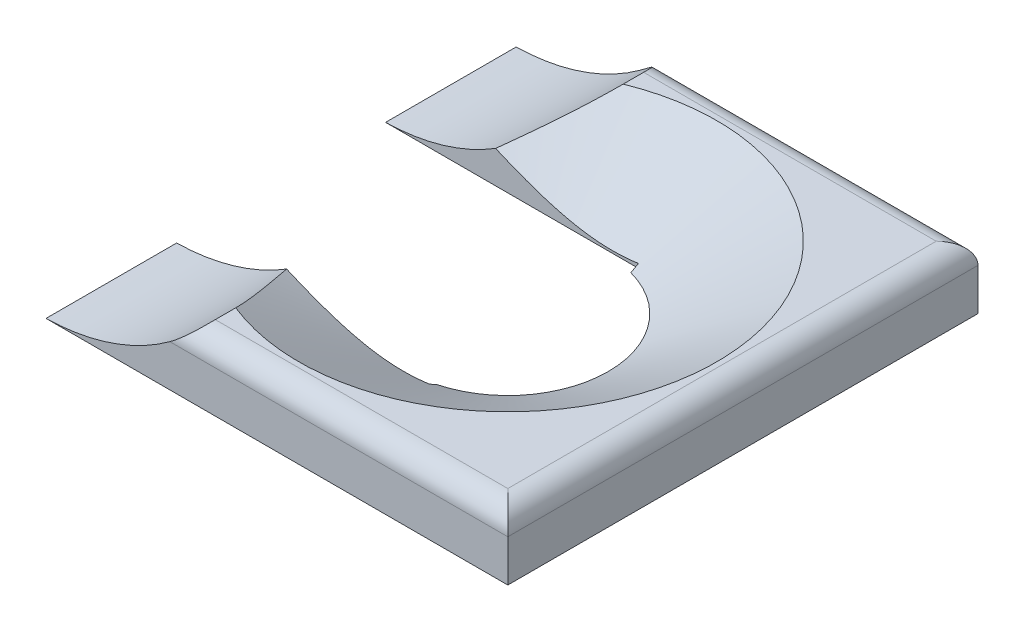
ISO-10303-21;
HEADER;
FILE_DESCRIPTION(('STEP AP214'),'2;1');
FILE_NAME('part.step','',(''),(''),'','','');
FILE_SCHEMA(('AUTOMOTIVE_DESIGN { 1 0 10303 214 1 1 1 1 }'));
ENDSEC;
DATA;
#1=APPLICATION_CONTEXT('core data for automotive mechanical design processes');
#2=APPLICATION_PROTOCOL_DEFINITION('international standard','automotive_design',2000,#1);
#3=PRODUCT_CONTEXT('',#1,'mechanical');
#4=PRODUCT('Part','Part','',(#3));
#5=PRODUCT_RELATED_PRODUCT_CATEGORY('part','',(#4));
#6=PRODUCT_DEFINITION_FORMATION('','',#4);
#7=PRODUCT_DEFINITION_CONTEXT('part definition',#1,'design');
#8=PRODUCT_DEFINITION('design','',#6,#7);
#9=PRODUCT_DEFINITION_SHAPE('','',#8);
#10=(LENGTH_UNIT() NAMED_UNIT(*) SI_UNIT(.MILLI.,.METRE.));
#11=(NAMED_UNIT(*) PLANE_ANGLE_UNIT() SI_UNIT($,.RADIAN.));
#12=(NAMED_UNIT(*) SI_UNIT($,.STERADIAN.) SOLID_ANGLE_UNIT());
#13=UNCERTAINTY_MEASURE_WITH_UNIT(LENGTH_MEASURE(1.E-05),#10,'distance_accuracy_value','');
#14=(GEOMETRIC_REPRESENTATION_CONTEXT(3) GLOBAL_UNCERTAINTY_ASSIGNED_CONTEXT((#13)) GLOBAL_UNIT_ASSIGNED_CONTEXT((#10,
#11,#12)) REPRESENTATION_CONTEXT('',''));
#15=CARTESIAN_POINT('',(0.,0.,0.));
#16=DIRECTION('',(0.,0.,1.));
#17=DIRECTION('',(1.,0.,0.));
#18=AXIS2_PLACEMENT_3D('',#15,#16,#17);
#19=CARTESIAN_POINT('',(0.,-6.,0.));
#20=DIRECTION('',(0.,1.,0.));
#21=DIRECTION('',(0.,0.,1.));
#22=AXIS2_PLACEMENT_3D('',#19,#20,#21);
#23=PLANE('',#22);
#24=DIRECTION('',(-1.,0.,0.));
#25=VECTOR('',#24,1.);
#26=CARTESIAN_POINT('',(25.,-5.99999999999999,-12.5));
#27=LINE('',#26,#25);
#28=CARTESIAN_POINT('',(25.,-5.99999999999999,-12.5));
#29=VERTEX_POINT('',#28);
#30=CARTESIAN_POINT('',(0.799608092284132,-6.,-12.5000000000001));
#31=VERTEX_POINT('',#30);
#32=EDGE_CURVE('E69',#29,#31,#27,.T.);
#33=ORIENTED_EDGE('',*,*,#32,.F.);
#34=DIRECTION('',(0.,0.,-1.));
#35=VECTOR('',#34,1.);
#36=CARTESIAN_POINT('',(25.,-5.99999999999999,-32.5));
#37=LINE('',#36,#35);
#38=CARTESIAN_POINT('',(25.,-5.99999999999999,-13.2232653275267));
#39=VERTEX_POINT('',#38);
#40=EDGE_CURVE('E144',#29,#39,#37,.T.);
#41=ORIENTED_EDGE('',*,*,#40,.T.);
#42=CARTESIAN_POINT('',(22.5,-6.,-22.5));
#43=DIRECTION('',(0.,1.,0.));
#44=DIRECTION('',(0.,0.,1.));
#45=AXIS2_PLACEMENT_3D('',#42,#43,#44);
#46=CIRCLE('',#45,9.60769515458667);
#47=CARTESIAN_POINT('',(25.,-5.99999999999999,-31.7767346724733));
#48=VERTEX_POINT('',#47);
#49=EDGE_CURVE('E234',#39,#48,#46,.T.);
#50=ORIENTED_EDGE('',*,*,#49,.T.);
#51=CARTESIAN_POINT('',(25.,-5.99999999999999,-32.5));
#52=VERTEX_POINT('',#51);
#53=EDGE_CURVE('E141',#48,#52,#37,.T.);
#54=ORIENTED_EDGE('',*,*,#53,.T.);
#55=DIRECTION('',(-1.,0.,0.));
#56=VECTOR('',#55,1.);
#57=CARTESIAN_POINT('',(25.,-5.99999999999999,-32.5));
#58=LINE('',#57,#56);
#59=CARTESIAN_POINT('',(0.799608092285013,-5.99999999999998,-32.5));
#60=VERTEX_POINT('',#59);
#61=EDGE_CURVE('E154',#52,#60,#58,.T.);
#62=ORIENTED_EDGE('',*,*,#61,.T.);
#63=DIRECTION('',(0.,0.,1.));
#64=VECTOR('',#63,1.);
#65=CARTESIAN_POINT('',(0.799608092284132,-6.,-1000.));
#66=LINE('',#65,#64);
#67=CARTESIAN_POINT('',(0.799608092284267,-5.99999999999999,-45.));
#68=VERTEX_POINT('',#67);
#69=EDGE_CURVE('E219',#60,#68,#66,.F.);
#70=ORIENTED_EDGE('',*,*,#69,.T.);
#71=DIRECTION('',(1.,0.,0.));
#72=VECTOR('',#71,1.);
#73=CARTESIAN_POINT('',(0.,-6.,-45.));
#74=LINE('',#73,#72);
#75=CARTESIAN_POINT('',(45.,-6.,-45.));
#76=VERTEX_POINT('',#75);
#77=EDGE_CURVE('E244',#68,#76,#74,.T.);
#78=ORIENTED_EDGE('',*,*,#77,.T.);
#79=DIRECTION('',(0.,0.,-1.));
#80=VECTOR('',#79,1.);
#81=CARTESIAN_POINT('',(45.,-6.,0.));
#82=LINE('',#81,#80);
#83=CARTESIAN_POINT('',(45.,-6.,0.));
#84=VERTEX_POINT('',#83);
#85=EDGE_CURVE('E238',#84,#76,#82,.T.);
#86=ORIENTED_EDGE('',*,*,#85,.F.);
#87=DIRECTION('',(1.,0.,0.));
#88=VECTOR('',#87,1.);
#89=CARTESIAN_POINT('',(0.,-6.,0.));
#90=LINE('',#89,#88);
#91=CARTESIAN_POINT('',(0.799608092284132,-6.,0.));
#92=VERTEX_POINT('',#91);
#93=EDGE_CURVE('E224',#92,#84,#90,.T.);
#94=ORIENTED_EDGE('',*,*,#93,.F.);
#95=EDGE_CURVE('E153',#92,#31,#66,.F.);
#96=ORIENTED_EDGE('',*,*,#95,.T.);
#97=EDGE_LOOP('',(#33,#41,#50,#54,#62,#70,#78,#86,#94,#96));
#98=FACE_BOUND('',#97,.T.);
#99=ADVANCED_FACE('F39',(#98),#23,.F.);
#100=CARTESIAN_POINT('',(22.5,0.,-22.5));
#101=DIRECTION('',(0.,1.,0.));
#102=DIRECTION('',(0.,0.,1.));
#103=AXIS2_PLACEMENT_3D('',#100,#101,#102);
#104=CONICAL_SURFACE('',#103,20.,1.0471975511966);
#105=CARTESIAN_POINT('',(43.4940559552794,1.87872098331582,-32.5));
#106=CARTESIAN_POINT('',(43.007728747701,1.62525957954242,-32.5));
#107=CARTESIAN_POINT('',(42.5207547233175,1.37302931281447,-32.5));
#108=CARTESIAN_POINT('',(41.5452087685271,0.871662224671157,-32.5));
#109=CARTESIAN_POINT('',(41.0566368151322,0.622525448008571,-32.5));
#110=CARTESIAN_POINT('',(40.0768771370397,0.127616322611146,-32.5));
#111=CARTESIAN_POINT('',(39.5856866036701,-0.118150474682648,-32.5));
#112=CARTESIAN_POINT('',(38.6010117134967,-0.605068731949847,-32.5));
#113=CARTESIAN_POINT('',(38.1075273262558,-0.84622013046344,-32.5));
#114=CARTESIAN_POINT('',(37.089596405798,-1.33634217174281,-32.5));
#115=CARTESIAN_POINT('',(36.564987243118,-1.58497588022162,-32.5));
#116=CARTESIAN_POINT('',(35.511958162939,-2.07400660911354,-32.5));
#117=CARTESIAN_POINT('',(34.983538416479,-2.31440399646478,-32.5));
#118=CARTESIAN_POINT('',(33.9222735551425,-2.78434956213583,-32.5));
#119=CARTESIAN_POINT('',(33.3894314054591,-3.01390441262653,-32.5));
#120=CARTESIAN_POINT('',(32.3177246917949,-3.45897208245175,-32.5));
#121=CARTESIAN_POINT('',(31.7788588845568,-3.67448193784091,-32.5));
#122=CARTESIAN_POINT('',(30.9326588806914,-3.99589819046851,-32.5));
#123=CARTESIAN_POINT('',(30.6277927581274,-4.10830160808771,-32.5));
#124=CARTESIAN_POINT('',(30.0155396750321,-4.3260837708094,-32.5));
#125=CARTESIAN_POINT('',(29.7081526372934,-4.43146229985293,-32.5));
#126=CARTESIAN_POINT('',(29.0907689920233,-4.6338845015016,-32.5));
#127=CARTESIAN_POINT('',(28.7807734659102,-4.73093145767983,-32.5));
#128=CARTESIAN_POINT('',(28.1578958168055,-4.91525638522499,-32.5));
#129=CARTESIAN_POINT('',(27.8450138805865,-5.00253498394545,-32.5));
#130=CARTESIAN_POINT('',(27.2229154463171,-5.16394489487067,-32.5));
#131=CARTESIAN_POINT('',(26.9137613618124,-5.23831520919239,-32.5));
#132=CARTESIAN_POINT('',(26.2926706817501,-5.37443591464721,-32.5));
#133=CARTESIAN_POINT('',(25.9807341383797,-5.43618654195559,-32.5));
#134=CARTESIAN_POINT('',(25.3544652187669,-5.54536850375159,-32.5));
#135=CARTESIAN_POINT('',(25.0401338122565,-5.59280534796775,-32.5));
#136=CARTESIAN_POINT('',(24.4094718723196,-5.67187758935576,-32.5));
#137=CARTESIAN_POINT('',(24.0931413573813,-5.70351313244601,-32.5));
#138=CARTESIAN_POINT('',(23.4544353884373,-5.75019228460836,-32.5));
#139=CARTESIAN_POINT('',(23.1320408255464,-5.76497792654521,-32.5));
#140=CARTESIAN_POINT('',(22.4869289319596,-5.77649886849303,-32.5));
#141=CARTESIAN_POINT('',(22.1642116044765,-5.77323434642111,-32.5));
#142=CARTESIAN_POINT('',(21.5194799756329,-5.7487891552913,-32.5));
#143=CARTESIAN_POINT('',(21.1974656412962,-5.72760934553205,-32.5));
#144=CARTESIAN_POINT('',(20.5550273436552,-5.66816363724642,-32.5));
#145=CARTESIAN_POINT('',(20.2346034303806,-5.62989720462828,-32.5));
#146=CARTESIAN_POINT('',(19.5875494795366,-5.53641427931121,-32.5));
#147=CARTESIAN_POINT('',(19.2609812915011,-5.48077369754318,-32.5));
#148=CARTESIAN_POINT('',(18.6107264607246,-5.35473593320268,-32.5));
#149=CARTESIAN_POINT('',(18.287039897491,-5.28433834477396,-32.5));
#150=CARTESIAN_POINT('',(17.6425716077276,-5.13066158627009,-32.5));
#151=CARTESIAN_POINT('',(17.3217915558282,-5.04737543491772,-32.5));
#152=CARTESIAN_POINT('',(16.8429584254359,-4.91419384364244,-32.5));
#153=CARTESIAN_POINT('',(16.683740542524,-4.8684257441897,-32.5));
#154=CARTESIAN_POINT('',(16.3660574441865,-4.77434805229323,-32.5));
#155=CARTESIAN_POINT('',(16.2075922261794,-4.7260384685728,-32.5));
#156=CARTESIAN_POINT('',(15.7280316619813,-4.57595737924169,-32.5));
#157=CARTESIAN_POINT('',(15.4080792973,-4.47052254573861,-32.5));
#158=CARTESIAN_POINT('',(14.7709606187218,-4.25151482670617,-32.5));
#159=CARTESIAN_POINT('',(14.4537945509965,-4.13794123006899,-32.5));
#160=CARTESIAN_POINT('',(13.8218978961244,-3.90391063334909,-32.5));
#161=CARTESIAN_POINT('',(13.5071681663124,-3.78345132502504,-32.5));
#162=CARTESIAN_POINT('',(12.8799938904579,-3.53676539145372,-32.5));
#163=CARTESIAN_POINT('',(12.5675492846814,-3.41053891759158,-32.5));
#164=CARTESIAN_POINT('',(11.9442675228702,-3.15303880043591,-32.5));
#165=CARTESIAN_POINT('',(11.6334330385138,-3.02175870427437,-32.5));
#166=CARTESIAN_POINT('',(11.0135502887583,-2.75504141057314,-32.5));
#167=CARTESIAN_POINT('',(10.7045020562975,-2.61960413666432,-32.5));
#168=CARTESIAN_POINT('',(9.77982575719238,-2.20805199858767,-32.5));
#169=CARTESIAN_POINT('',(9.16655078197433,-1.92664862695632,-32.5));
#170=CARTESIAN_POINT('',(7.94206397192468,-1.35213759274943,-32.5));
#171=CARTESIAN_POINT('',(7.33087492911006,-1.05898166261703,-32.5));
#172=CARTESIAN_POINT('',(6.11234248472904,-0.464752277876298,-32.5));
#173=CARTESIAN_POINT('',(5.50499920398272,-0.163678576036185,-32.5));
#174=CARTESIAN_POINT('',(4.29382897364554,0.444315736778011,-32.5));
#175=CARTESIAN_POINT('',(3.68999971043564,0.751231749612328,-32.5));
#176=CARTESIAN_POINT('',(2.4847901432784,1.36981213210454,-32.5));
#177=CARTESIAN_POINT('',(1.88340981201425,1.68147644861223,-32.5));
#178=CARTESIAN_POINT('',(0.765518445295967,2.26529684285077,-32.5));
#179=CARTESIAN_POINT('',(0.248753206499583,2.53696681377059,-32.5));
#180=CARTESIAN_POINT('',(-0.783540351624226,3.08264775779926,-32.5));
#181=CARTESIAN_POINT('',(-1.29906866851242,3.35665873551975,-32.5));
#182=CARTESIAN_POINT('',(-2.84430998262122,4.18173494027465,-32.5));
#183=CARTESIAN_POINT('',(-3.87245945932132,4.7357281650839,-32.5));
#184=CARTESIAN_POINT('',(-5.91648115136875,5.84432623183798,-32.5));
#185=CARTESIAN_POINT('',(-6.93238066594894,6.39888083868717,-32.5));
#186=CARTESIAN_POINT('',(-8.4544040630653,7.23374911061521,-32.5));
#187=CARTESIAN_POINT('',(-8.96138007503282,7.51251091686916,-32.5));
#188=CARTESIAN_POINT('',(-9.97483005153627,8.07094361231531,-32.5));
#189=CARTESIAN_POINT('',(-10.4813040169609,8.35061449989459,-32.5));
#190=CARTESIAN_POINT('',(-10.9875606954573,8.63067800926934,-32.5));
#191=B_SPLINE_CURVE_WITH_KNOTS('',3,(#105,#106,#107,#108,#109,#110,#111,#112,#113,#114,#115,
#116,#117,#118,#119,#120,#121,#122,#123,#124,#125,#126,#127,#128,#129,#130,#131,#132,#133,#134,
#135,#136,#137,#138,#139,#140,#141,#142,#143,#144,#145,#146,#147,#148,#149,#150,#151,#152,#153,
#154,#155,#156,#157,#158,#159,#160,#161,#162,#163,#164,#165,#166,#167,#168,#169,#170,#171,#172,
#173,#174,#175,#176,#177,#178,#179,#180,#181,#182,#183,#184,#185,#186,#187,#188,#189,#190),
.UNSPECIFIED.,.F.,.F.,(4,2,2,2,2,2,2,2,2,2,2,2,2,2,2,2,2,2,2,2,2,2,2,2,2,2,2,2,2,2,2,2,2,2,2,2,
2,2,2,2,2,2,4),(0.,1.6452441376992,3.29051204908708,4.9382255333208,6.58596094367785,
8.32754438780895,10.0690501411154,11.8094698767187,13.5502557153952,14.5249698217452,
15.4997138927922,16.4740720248454,17.4483675447147,18.4020589102933,19.3557324260679,
20.3090383796912,21.2623355297698,22.2300391855501,23.1977333028721,24.1653810078172,
25.1330589615046,26.1264961777168,27.1199607196335,28.1139652818762,28.6109444875942,
29.1079219876073,30.118408162236,31.1289827339338,32.1398980819833,33.1507869092533,
34.1630123704771,35.1752564378591,37.1993697561408,39.2328790004987,41.2664518165886,
43.2984853795216,45.3304962135453,47.0819625362271,48.8334323099922,52.3371166393677,
55.8093151537973,57.5449973463896,59.2806764611538),.UNSPECIFIED.);
#192=CARTESIAN_POINT('',(25.,-5.59581502667344,-32.5));
#193=VERTEX_POINT('',#192);
#194=CARTESIAN_POINT('',(11.3311951751726,-2.8917141078333,-32.5));
#195=VERTEX_POINT('',#194);
#196=EDGE_CURVE('E61',#193,#195,#191,.T.);
#197=ORIENTED_EDGE('',*,*,#196,.F.);
#198=CARTESIAN_POINT('',(25.,-5.59542294744274,-32.5007));
#199=CARTESIAN_POINT('',(25.,-5.71798390812599,-32.2818761307911));
#200=CARTESIAN_POINT('',(25.,-5.84037278324019,-32.0629556192703));
#201=CARTESIAN_POINT('',(25.,-6.08471149163078,-31.624868143803));
#202=CARTESIAN_POINT('',(25.,-6.20666132242188,-31.4057011784706));
#203=CARTESIAN_POINT('',(25.,-6.45005719331809,-30.9670133085192));
#204=CARTESIAN_POINT('',(25.,-6.57150309479022,-30.7474923269443));
#205=CARTESIAN_POINT('',(25.,-6.81372406570912,-30.3080810788126));
#206=CARTESIAN_POINT('',(25.,-6.93449913680215,-30.0881908131638));
#207=CARTESIAN_POINT('',(25.,-7.17490188956893,-29.6484857665701));
#208=CARTESIAN_POINT('',(25.,-7.29453166249714,-29.4286721298185));
#209=CARTESIAN_POINT('',(25.,-7.53269407588617,-28.9884514127713));
#210=CARTESIAN_POINT('',(25.,-7.65122671932992,-28.7680443340912));
#211=CARTESIAN_POINT('',(25.,-7.88682444978953,-28.3264823767199));
#212=CARTESIAN_POINT('',(25.,-8.00388972242478,-28.1053275971985));
#213=CARTESIAN_POINT('',(25.,-8.23604609260065,-27.6619854550818));
#214=CARTESIAN_POINT('',(25.,-8.35113721851594,-27.4397981073863));
#215=CARTESIAN_POINT('',(25.,-8.57769124641609,-26.9956891055971));
#216=CARTESIAN_POINT('',(25.,-8.68917497297535,-26.773778097628));
#217=CARTESIAN_POINT('',(25.,-8.90822369633672,-26.3279645369578));
#218=CARTESIAN_POINT('',(25.,-9.01578800030748,-26.1040616407727));
#219=CARTESIAN_POINT('',(25.,-9.1729029944812,-25.765511970469));
#220=CARTESIAN_POINT('',(25.,-9.22470054669997,-25.6519092808027));
#221=CARTESIAN_POINT('',(25.,-9.3263730448434,-25.4238486600082));
#222=CARTESIAN_POINT('',(25.,-9.37624805852581,-25.3093907591911));
#223=CARTESIAN_POINT('',(25.,-9.47356140009374,-25.0794620178723));
#224=CARTESIAN_POINT('',(25.,-9.52100015392408,-24.9639913585984));
#225=CARTESIAN_POINT('',(25.,-9.61276277136262,-24.731824749168));
#226=CARTESIAN_POINT('',(25.,-9.65708687770312,-24.6151288953106));
#227=CARTESIAN_POINT('',(25.,-9.75205206385703,-24.3516520643247));
#228=CARTESIAN_POINT('',(25.,-9.80159982611433,-24.2044705200988));
#229=CARTESIAN_POINT('',(25.,-9.89220692905542,-23.9074681007986));
#230=CARTESIAN_POINT('',(25.,-9.93326594090322,-23.7576471237223));
#231=CARTESIAN_POINT('',(25.,-10.0034996619226,-23.4569850763879));
#232=CARTESIAN_POINT('',(25.,-10.0328077563961,-23.3061764334474));
#233=CARTESIAN_POINT('',(25.,-10.066106700383,-23.0784403812983));
#234=CARTESIAN_POINT('',(25.,-10.0754288745086,-23.0022798004238));
#235=CARTESIAN_POINT('',(25.,-10.0902329286604,-22.8495904799849));
#236=CARTESIAN_POINT('',(25.,-10.0957153810251,-22.7730617970018));
#237=CARTESIAN_POINT('',(25.,-10.1026913417669,-22.6188174596598));
#238=CARTESIAN_POINT('',(25.,-10.1041317019276,-22.5410993796122));
#239=CARTESIAN_POINT('',(25.,-10.1028183651766,-22.3856990850083));
#240=CARTESIAN_POINT('',(25.,-10.1000646587005,-22.3080168705343));
#241=CARTESIAN_POINT('',(25.,-10.0904646922944,-22.1528977825104));
#242=CARTESIAN_POINT('',(25.,-10.0836179248267,-22.0754609405839));
#243=CARTESIAN_POINT('',(25.,-10.0660734555734,-21.9210202685318));
#244=CARTESIAN_POINT('',(25.,-10.0553750793206,-21.8440165166461));
#245=CARTESIAN_POINT('',(25.,-10.0177123301459,-21.6120979345454));
#246=CARTESIAN_POINT('',(25.,-9.98530271797792,-21.4580485176302));
#247=CARTESIAN_POINT('',(25.,-9.92833229006436,-21.2291463869074));
#248=CARTESIAN_POINT('',(25.,-9.90794420938477,-21.1531916179345));
#249=CARTESIAN_POINT('',(25.,-9.86476560805213,-21.0019674363668));
#250=CARTESIAN_POINT('',(25.,-9.84197521773316,-20.9266979868314));
#251=CARTESIAN_POINT('',(25.,-9.7736918965284,-20.711813893376));
#252=CARTESIAN_POINT('',(25.,-9.72565208985985,-20.5730106257955));
#253=CARTESIAN_POINT('',(25.,-9.62429358442304,-20.297331971462));
#254=CARTESIAN_POINT('',(25.,-9.5709734186144,-20.1604571326168));
#255=CARTESIAN_POINT('',(25.,-9.46036000184065,-19.8881752099077));
#256=CARTESIAN_POINT('',(25.,-9.40306289083896,-19.7527697038093));
#257=CARTESIAN_POINT('',(25.,-9.28552405973546,-19.4832666404652));
#258=CARTESIAN_POINT('',(25.,-9.22528263716398,-19.3491689526972));
#259=CARTESIAN_POINT('',(25.,-9.10238080747231,-19.0816453708354));
#260=CARTESIAN_POINT('',(25.,-9.03971422628722,-18.9482223230742));
#261=CARTESIAN_POINT('',(25.,-8.91262201810944,-18.6822152267993));
#262=CARTESIAN_POINT('',(25.,-8.84819634855885,-18.54963119868));
#263=CARTESIAN_POINT('',(25.,-8.65293911618022,-18.1530403797228));
#264=CARTESIAN_POINT('',(25.,-8.52005703322708,-17.8900442870057));
#265=CARTESIAN_POINT('',(25.,-8.25045270572592,-17.3652137865926));
#266=CARTESIAN_POINT('',(25.,-8.1137217336611,-17.1033838938536));
#267=CARTESIAN_POINT('',(25.,-7.83783448953081,-16.5809645228569));
#268=CARTESIAN_POINT('',(25.,-7.69867791217248,-16.3203752060734));
#269=CARTESIAN_POINT('',(25.,-7.41887059384313,-15.8005001834014));
#270=CARTESIAN_POINT('',(25.,-7.27822237461007,-15.5412131174116));
#271=CARTESIAN_POINT('',(25.,-6.99568273548935,-15.0233169758727));
#272=CARTESIAN_POINT('',(25.,-6.85379131248053,-14.7647079020278));
#273=CARTESIAN_POINT('',(25.,-6.61891985026178,-14.3384696715833));
#274=CARTESIAN_POINT('',(25.,-6.52621040947891,-14.1706912369273));
#275=CARTESIAN_POINT('',(25.,-6.34043147756909,-13.8352738490543));
#276=CARTESIAN_POINT('',(25.,-6.2473618948925,-13.6676349465436));
#277=CARTESIAN_POINT('',(25.,-6.06127212645419,-13.3331135499874));
#278=CARTESIAN_POINT('',(25.,-5.96825295199788,-13.1662304931722));
#279=CARTESIAN_POINT('',(25.,-5.78199745106825,-12.8326459181289));
#280=CARTESIAN_POINT('',(25.,-5.68876119150511,-12.6659443625452));
#281=CARTESIAN_POINT('',(25.,-5.59542294744274,-12.4993));
#282=B_SPLINE_CURVE_WITH_KNOTS('',3,(#198,#199,#200,#201,#202,#203,#204,#205,#206,#207,#208,
#209,#210,#211,#212,#213,#214,#215,#216,#217,#218,#219,#220,#221,#222,#223,#224,#225,#226,#227,
#228,#229,#230,#231,#232,#233,#234,#235,#236,#237,#238,#239,#240,#241,#242,#243,#244,#245,#246,
#247,#248,#249,#250,#251,#252,#253,#254,#255,#256,#257,#258,#259,#260,#261,#262,#263,#264,#265,
#266,#267,#268,#269,#270,#271,#272,#273,#274,#275,#276,#277,#278,#279,#280,#281),.UNSPECIFIED.,
.F.,.F.,(4,2,2,2,2,2,2,2,2,2,2,2,2,2,2,2,2,2,2,2,2,2,2,2,2,2,2,2,2,2,2,2,2,2,2,2,2,2,2,2,2,4),
(0.,0.75242678423455,1.50485782103585,2.25748369856578,3.01010772828899,3.76088090291765,
4.51165203570408,5.26232721907431,6.0129916038338,6.75799166213904,7.50312278051934,
7.87767171769856,8.25220744222272,8.6266774600948,9.00111826213907,9.46681932693975,
9.93253842862219,10.3928103422615,10.6229146853387,10.8529847223789,11.0860660160963,
11.319147841353,11.5522585746508,11.7854101485708,12.2570224499882,12.4929298184241,
12.7288243946047,13.1693088555633,13.6099160413463,14.0509570293145,14.4919535407229,
14.934158027003,15.3763732211019,16.2603052170913,17.1464352553107,18.0326776411804,
18.9176058003304,19.8025361818019,20.377602606714,20.9528263322793,21.5259951164235,
22.0990059400322),.UNSPECIFIED.);
#283=EDGE_CURVE('E11',#193,#48,#282,.T.);
#284=ORIENTED_EDGE('',*,*,#283,.T.);
#285=ORIENTED_EDGE('',*,*,#49,.F.);
#286=CARTESIAN_POINT('',(25.,-5.59581502667344,-12.5));
#287=VERTEX_POINT('',#286);
#288=EDGE_CURVE('E44',#39,#287,#282,.T.);
#289=ORIENTED_EDGE('',*,*,#288,.T.);
#290=CARTESIAN_POINT('',(-10.9875606954573,8.63067800926933,-12.5));
#291=CARTESIAN_POINT('',(-10.2492738137513,8.22227397900555,-12.5));
#292=CARTESIAN_POINT('',(-9.51053718979665,7.81467997109563,-12.5));
#293=CARTESIAN_POINT('',(-8.03192208846583,7.00155067685479,-12.5));
#294=CARTESIAN_POINT('',(-7.29204359934074,6.59601541189349,-12.5));
#295=CARTESIAN_POINT('',(-5.81059202647232,5.78727297921735,-12.5));
#296=CARTESIAN_POINT('',(-5.06901834061507,5.38406691368944,-12.5));
#297=CARTESIAN_POINT('',(-3.58417934754002,4.58078710143311,-12.5));
#298=CARTESIAN_POINT('',(-2.84091404769657,4.18071334108344,-12.5));
#299=CARTESIAN_POINT('',(-1.34306373339916,3.37960487705246,-12.5));
#300=CARTESIAN_POINT('',(-0.588452356161276,2.97861941591118,-12.5));
#301=CARTESIAN_POINT('',(0.923535517114934,2.18189627533595,-12.5));
#302=CARTESIAN_POINT('',(1.68091199936142,1.78615856977262,-12.5));
#303=CARTESIAN_POINT('',(3.1991038380684,1.00169773355637,-12.5));
#304=CARTESIAN_POINT('',(3.95991848224344,0.612973226421286,-12.5));
#305=CARTESIAN_POINT('',(5.48626455132046,-0.155098712782303,-12.5));
#306=CARTESIAN_POINT('',(6.25179585250347,-0.534446389510056,-12.5));
#307=CARTESIAN_POINT('',(7.40956247907183,-1.09589527669545,-12.5));
#308=CARTESIAN_POINT('',(7.79942908629263,-1.28288041567618,-12.5));
#309=CARTESIAN_POINT('',(8.58107899672395,-1.65279611526477,-12.5));
#310=CARTESIAN_POINT('',(8.97286227690192,-1.83572672445032,-12.5));
#311=CARTESIAN_POINT('',(9.75878019715877,-2.19674679255358,-12.5));
#312=CARTESIAN_POINT('',(10.1529154191161,-2.37483498727772,-12.5));
#313=CARTESIAN_POINT('',(10.9438296108025,-2.72505083016058,-12.5));
#314=CARTESIAN_POINT('',(11.3406085669806,-2.89717850884311,-12.5));
#315=CARTESIAN_POINT('',(12.1370473591925,-3.23401709896137,-12.5));
#316=CARTESIAN_POINT('',(12.5367054278548,-3.39873217413624,-12.5));
#317=CARTESIAN_POINT('',(13.3396623549921,-3.71911604655872,-12.5));
#318=CARTESIAN_POINT('',(13.7429613480274,-3.8747845078692,-12.5));
#319=CARTESIAN_POINT('',(14.5536628379415,-4.17481684863279,-12.5));
#320=CARTESIAN_POINT('',(14.9610642970274,-4.31918350983564,-12.5));
#321=CARTESIAN_POINT('',(15.7805452141751,-4.5938341175497,-12.5));
#322=CARTESIAN_POINT('',(16.1926241814018,-4.7241195268565,-12.5));
#323=CARTESIAN_POINT('',(17.160332652696,-5.0077627725613,-12.5));
#324=CARTESIAN_POINT('',(17.7180186735688,-5.15433180405747,-12.5));
#325=CARTESIAN_POINT('',(18.5613540587059,-5.34362055466987,-12.5));
#326=CARTESIAN_POINT('',(18.8435992973583,-5.4016225302207,-12.5));
#327=CARTESIAN_POINT('',(19.4101895170866,-5.50617518932327,-12.5));
#328=CARTESIAN_POINT('',(19.6945342196381,-5.55272736470912,-12.5));
#329=CARTESIAN_POINT('',(20.2628465422748,-5.63291094298601,-12.5));
#330=CARTESIAN_POINT('',(20.5468005871226,-5.66663790847893,-12.5));
#331=CARTESIAN_POINT('',(21.1159874821068,-5.72072256294025,-12.5));
#332=CARTESIAN_POINT('',(21.4012203141575,-5.74108044038977,-12.5));
#333=CARTESIAN_POINT('',(21.9723033997742,-5.76780444549583,-12.5));
#334=CARTESIAN_POINT('',(22.2581535529202,-5.77417269907106,-12.5));
#335=CARTESIAN_POINT('',(22.8298178040434,-5.7727209830008,-12.5));
#336=CARTESIAN_POINT('',(23.1156319019969,-5.76490100405012,-12.5));
#337=CARTESIAN_POINT('',(23.6854143575895,-5.73537918021831,-12.5));
#338=CARTESIAN_POINT('',(23.9693855625302,-5.71373173257531,-12.5));
#339=CARTESIAN_POINT('',(24.5360052848094,-5.65725660061309,-12.5));
#340=CARTESIAN_POINT('',(24.8186537889634,-5.62242878519494,-12.5));
#341=CARTESIAN_POINT('',(25.3822389514352,-5.54054004304786,-12.5));
#342=CARTESIAN_POINT('',(25.6631751100408,-5.49347570530144,-12.5));
#343=CARTESIAN_POINT('',(26.2229675918735,-5.38826034504727,-12.5));
#344=CARTESIAN_POINT('',(26.5018237749042,-5.33010858210719,-12.5));
#345=CARTESIAN_POINT('',(27.0615987392381,-5.20295491686171,-12.5));
#346=CARTESIAN_POINT('',(27.3424821823416,-5.13379837873031,-12.5));
#347=CARTESIAN_POINT('',(27.9018865635477,-4.9865584316793,-12.5));
#348=CARTESIAN_POINT('',(28.1804074982521,-4.90847500992191,-12.5));
#349=CARTESIAN_POINT('',(28.7351145414487,-4.74455779963943,-12.5));
#350=CARTESIAN_POINT('',(29.0113009105614,-4.65872488907089,-12.5));
#351=CARTESIAN_POINT('',(29.5614906434605,-4.48035042460121,-12.5));
#352=CARTESIAN_POINT('',(29.8354940021474,-4.38780885503352,-12.5));
#353=CARTESIAN_POINT('',(30.4064928302251,-4.18819282234531,-12.5));
#354=CARTESIAN_POINT('',(30.7032939152036,-4.08056374831582,-12.5));
#355=CARTESIAN_POINT('',(31.2947081058927,-3.85943684913234,-12.5));
#356=CARTESIAN_POINT('',(31.5893211202971,-3.74593878062708,-12.5));
#357=CARTESIAN_POINT('',(32.1766116582926,-3.51392920420155,-12.5));
#358=CARTESIAN_POINT('',(32.469288893028,-3.39541696675306,-12.5));
#359=CARTESIAN_POINT('',(33.052877470778,-3.15411524285131,-12.5));
#360=CARTESIAN_POINT('',(33.3437887758096,-3.03132566477815,-12.5));
#361=CARTESIAN_POINT('',(34.2147433586723,-2.6572341838253,-12.5));
#362=CARTESIAN_POINT('',(34.7924290764446,-2.40044083174032,-12.5));
#363=CARTESIAN_POINT('',(35.9427703393445,-1.87602060091302,-12.5));
#364=CARTESIAN_POINT('',(36.5154262889825,-1.60839460325855,-12.5));
#365=CARTESIAN_POINT('',(37.6262707830827,-1.0794226549641,-12.5));
#366=CARTESIAN_POINT('',(38.1646645081592,-0.818506518362931,-12.5));
#367=CARTESIAN_POINT('',(39.2386124797975,-0.290870528079602,-12.5));
#368=CARTESIAN_POINT('',(39.7741666490672,-0.0241505174154651,-12.5));
#369=CARTESIAN_POINT('',(40.8415396604781,0.513174163157176,-12.5));
#370=CARTESIAN_POINT('',(41.3733646408171,0.78376666266338,-12.5));
#371=CARTESIAN_POINT('',(42.4350651653947,1.32866502578096,-12.5));
#372=CARTESIAN_POINT('',(42.9649408375911,1.60297063991551,-12.5));
#373=CARTESIAN_POINT('',(43.4940559552794,1.87872098331582,-12.5));
#374=B_SPLINE_CURVE_WITH_KNOTS('',3,(#290,#291,#292,#293,#294,#295,#296,#297,#298,#299,#300,
#301,#302,#303,#304,#305,#306,#307,#308,#309,#310,#311,#312,#313,#314,#315,#316,#317,#318,#319,
#320,#321,#322,#323,#324,#325,#326,#327,#328,#329,#330,#331,#332,#333,#334,#335,#336,#337,#338,
#339,#340,#341,#342,#343,#344,#345,#346,#347,#348,#349,#350,#351,#352,#353,#354,#355,#356,#357,
#358,#359,#360,#361,#362,#363,#364,#365,#366,#367,#368,#369,#370,#371,#372,#373),.UNSPECIFIED.,
.F.,.F.,(4,2,2,2,2,2,2,2,2,2,2,2,2,2,2,2,2,2,2,2,2,2,2,2,2,2,2,2,2,2,2,2,2,2,2,2,2,2,2,2,2,4),
(0.,2.53115798570342,5.06234219115231,7.59463946951252,10.1269257297211,12.6905112441588,
15.2540839893225,17.8171479841755,20.3801450330962,21.677291020742,22.9744214587527,
24.2718873448985,25.5693465857389,26.8660676932308,28.1628369224591,29.4592859634272,
30.755600196321,32.4840894304782,33.3483283069396,34.212454519003,35.0700095804923,
35.9275525516732,36.7849651982085,37.6423784070689,38.4964391555134,39.3505083991233,
40.2048159763349,41.0591806252864,41.9268285090845,42.7944776406655,43.6620285974295,
44.5295815802271,45.4766476791934,46.4237530787322,47.3709967528826,48.318260729323,
50.2146563985558,52.110898130623,53.9057092497849,55.700568975114,57.490671301159,
59.2806539449314),.UNSPECIFIED.);
#375=CARTESIAN_POINT('',(11.3311951751727,-2.89171410783328,-12.5));
#376=VERTEX_POINT('',#375);
#377=EDGE_CURVE('E138',#376,#287,#374,.T.);
#378=ORIENTED_EDGE('',*,*,#377,.F.);
#379=CARTESIAN_POINT('',(15.5824246996583,0.600200000000019,-42.3698502226921));
#380=CARTESIAN_POINT('',(15.4793337236013,0.489584109900608,-42.1310839150456));
#381=CARTESIAN_POINT('',(15.3752383382407,0.38032281613128,-41.8921268693699));
#382=CARTESIAN_POINT('',(15.1652974052909,0.164691810221797,-41.4136750168569));
#383=CARTESIAN_POINT('',(15.0594518438838,0.0583221209287126,-41.1741802057869));
#384=CARTESIAN_POINT('',(14.7396535114841,-0.25619976283732,-40.4545999505932));
#385=CARTESIAN_POINT('',(14.5234651864348,-0.45973682217607,-39.9734787400013));
#386=CARTESIAN_POINT('',(14.0866988032886,-0.853950007200129,-39.0047615244946));
#387=CARTESIAN_POINT('',(13.8661045152744,-1.04455880768762,-38.5171454143227));
#388=CARTESIAN_POINT('',(13.4248710544257,-1.41033950897243,-37.5361851989056));
#389=CARTESIAN_POINT('',(13.2042318840621,-1.58551210506011,-37.0428413527879));
#390=CARTESIAN_POINT('',(12.7601406954712,-1.92419417413827,-36.0334837505182));
#391=CARTESIAN_POINT('',(12.5368106935152,-2.08717961307857,-35.5172392988319));
#392=CARTESIAN_POINT('',(12.0993321015491,-2.39404637708077,-34.4751713740682));
#393=CARTESIAN_POINT('',(11.8851841443346,-2.53792638688913,-33.9493472443386));
#394=CARTESIAN_POINT('',(11.4721803338126,-2.80529453657153,-32.8879591294875));
#395=CARTESIAN_POINT('',(11.2732917907938,-2.92882695724043,-32.3524191872478));
#396=CARTESIAN_POINT('',(10.8963059625943,-3.15522154119687,-31.2698573241778));
#397=CARTESIAN_POINT('',(10.7182037162354,-3.25808864103399,-30.7228381800753));
#398=CARTESIAN_POINT('',(10.3661933067903,-3.45555187513055,-29.5414737873944));
#399=CARTESIAN_POINT('',(10.1961992781995,-3.54708641448579,-28.9054280225588));
#400=CARTESIAN_POINT('',(9.89904727210739,-3.70311109641627,-27.6198707223686));
#401=CARTESIAN_POINT('',(9.77189800547879,-3.76759574006324,-26.9703564771649));
#402=CARTESIAN_POINT('',(9.5685712257895,-3.86910296355533,-25.6699343418406));
#403=CARTESIAN_POINT('',(9.4917481699229,-3.90647403164348,-25.0191560297893));
#404=CARTESIAN_POINT('',(9.39066712612744,-3.95539912182057,-23.7125752207085));
#405=CARTESIAN_POINT('',(9.36640350031799,-3.96695591292792,-23.0567732701225));
#406=CARTESIAN_POINT('',(9.37180687098169,-3.96436645358778,-21.7438106226188));
#407=CARTESIAN_POINT('',(9.40160832436396,-3.95015612175213,-21.0866506091387));
#408=CARTESIAN_POINT('',(9.51371729364213,-3.89577125562483,-19.777904600009));
#409=CARTESIAN_POINT('',(9.59603051526141,-3.85559389985168,-19.1263192178746));
#410=CARTESIAN_POINT('',(9.81005367235869,-3.74827428327659,-17.8247616310924));
#411=CARTESIAN_POINT('',(9.94240299325443,-3.6807821586096,-17.1749249272572));
#412=CARTESIAN_POINT('',(10.2493399944484,-3.51858955781341,-15.8890357078138));
#413=CARTESIAN_POINT('',(10.4239199966348,-3.42389402704677,-15.2529807093831));
#414=CARTESIAN_POINT('',(10.7807468651487,-3.2221204319048,-14.0817975368065));
#415=CARTESIAN_POINT('',(10.9586976258725,-3.11849473532532,-13.5447397305028));
#416=CARTESIAN_POINT('',(11.3340943776521,-2.89128077152016,-12.4817000251106));
#417=CARTESIAN_POINT('',(11.5315446643903,-2.76768810180473,-11.9557205976552));
#418=CARTESIAN_POINT('',(11.9406510173547,-2.50092325477353,-10.9131195781489));
#419=CARTESIAN_POINT('',(12.1523352653554,-2.35771161587731,-10.3965192853407));
#420=CARTESIAN_POINT('',(12.5842031687167,-2.05287096053353,-9.37247613130817));
#421=CARTESIAN_POINT('',(12.8043862760529,-1.89124313029376,-8.86503268271718));
#422=CARTESIAN_POINT('',(13.2419120335716,-1.55584829887118,-7.87259485256118));
#423=CARTESIAN_POINT('',(13.4591450351172,-1.38258395298039,-7.38738118602144));
#424=CARTESIAN_POINT('',(13.8934055573322,-1.02116852284915,-6.42242974610505));
#425=CARTESIAN_POINT('',(14.110433068959,-0.833016811735368,-5.94269220428996));
#426=CARTESIAN_POINT('',(14.540176007977,-0.444119682640521,-4.98935469632958));
#427=CARTESIAN_POINT('',(14.7529064267968,-0.243434636610994,-4.51573683979566));
#428=CARTESIAN_POINT('',(15.0676309620328,0.0665107533009785,-3.8073311268202));
#429=CARTESIAN_POINT('',(15.1718046637543,0.171305800965943,-3.57154645692195));
#430=CARTESIAN_POINT('',(15.3784515963422,0.383696207841556,-3.10049610011451));
#431=CARTESIAN_POINT('',(15.4809248398698,0.491291546186589,-2.86523040935243));
#432=CARTESIAN_POINT('',(15.5824246996583,0.600200000000025,-2.63014977730788));
#433=B_SPLINE_CURVE_WITH_KNOTS('',3,(#379,#380,#381,#382,#383,#384,#385,#386,#387,#388,#389,
#390,#391,#392,#393,#394,#395,#396,#397,#398,#399,#400,#401,#402,#403,#404,#405,#406,#407,#408,
#409,#410,#411,#412,#413,#414,#415,#416,#417,#418,#419,#420,#421,#422,#423,#424,#425,#426,#427,
#428,#429,#430,#431,#432),.UNSPECIFIED.,.F.,.F.,(4,2,2,2,2,2,2,2,2,2,2,2,2,2,2,2,2,2,2,2,2,2,2,
2,2,2,4),(0.,0.847843593501061,1.69569388401572,3.39160799450281,5.09576580140752,
6.7998468089421,8.55630980219814,10.3128936510395,12.0656027859685,13.8178927330681,
15.8101387194066,17.8027895100732,19.7693519288827,21.7357033904339,23.7069517664327,
25.6784143670609,27.6759708753241,29.673164473279,31.397858109253,33.122932540798,
34.8515291744346,36.5800145300735,38.257199525579,39.9344551811792,41.6041760779731,
42.4389389490457,43.2736956018866),.UNSPECIFIED.);
#434=CARTESIAN_POINT('',(15.,0.,-3.95950378226081));
#435=VERTEX_POINT('',#434);
#436=EDGE_CURVE('E207',#376,#435,#433,.T.);
#437=ORIENTED_EDGE('',*,*,#436,.T.);
#438=CARTESIAN_POINT('',(22.5,0.,-22.5));
#439=DIRECTION('',(0.,1.,0.));
#440=DIRECTION('',(0.,0.,1.));
#441=AXIS2_PLACEMENT_3D('',#438,#439,#440);
#442=CIRCLE('',#441,20.);
#443=CARTESIAN_POINT('',(15.,0.,-41.0404962177391));
#444=VERTEX_POINT('',#443);
#445=EDGE_CURVE('E236',#435,#444,#442,.T.);
#446=ORIENTED_EDGE('',*,*,#445,.T.);
#447=EDGE_CURVE('E210',#444,#195,#433,.T.);
#448=ORIENTED_EDGE('',*,*,#447,.T.);
#449=EDGE_LOOP('',(#197,#284,#285,#289,#378,#437,#446,#448));
#450=FACE_BOUND('',#449,.T.);
#451=ADVANCED_FACE('F172',(#450),#104,.F.);
#452=CARTESIAN_POINT('',(0.399804046142132,14.7504898846447,-1000.));
#453=DIRECTION('',(0.,0.,1.));
#454=DIRECTION('',(1.,0.,0.));
#455=AXIS2_PLACEMENT_3D('',#452,#453,#454);
#456=CYLINDRICAL_SURFACE('',#455,20.7543410815196);
#457=CARTESIAN_POINT('',(0.399804046142132,14.7504898846447,-12.5));
#458=DIRECTION('',(0.,0.,-1.));
#459=DIRECTION('',(-1.,0.,0.));
#460=AXIS2_PLACEMENT_3D('',#457,#458,#459);
#461=CIRCLE('',#460,20.7543410815196);
#462=EDGE_CURVE('E231',#31,#376,#461,.F.);
#463=ORIENTED_EDGE('',*,*,#462,.F.);
#464=ORIENTED_EDGE('',*,*,#95,.F.);
#465=CARTESIAN_POINT('',(0.399804046142132,14.7504898846447,0.));
#466=DIRECTION('',(0.,0.,1.));
#467=DIRECTION('',(-1.,0.,0.));
#468=AXIS2_PLACEMENT_3D('',#465,#466,#467);
#469=CIRCLE('',#468,20.7543410815196);
#470=CARTESIAN_POINT('',(12.6539365063561,-2.,0.));
#471=VERTEX_POINT('',#470);
#472=EDGE_CURVE('E220',#92,#471,#469,.T.);
#473=ORIENTED_EDGE('',*,*,#472,.T.);
#474=CARTESIAN_POINT('',(12.6539365063561,-2.,0.));
#475=CARTESIAN_POINT('',(12.7093719574152,-1.95944555299353,-2.64317451704608E-06));
#476=CARTESIAN_POINT('',(12.7646018604471,-1.91861806386664,-0.00123341470792709));
#477=CARTESIAN_POINT('',(12.8745904459696,-1.83646553852481,-0.00627163108184155));
#478=CARTESIAN_POINT('',(12.9293490191148,-1.79514039192175,-0.010079658337046));
#479=CARTESIAN_POINT('',(13.0932219805325,-1.67018966085204,-0.0255904207651618));
#480=CARTESIAN_POINT('',(13.2014928163087,-1.58591130085437,-0.0413818065494126));
#481=CARTESIAN_POINT('',(13.4164334867175,-1.41518799585573,-0.0853509542272282));
#482=CARTESIAN_POINT('',(13.5230566413239,-1.32872939765624,-0.113706757371334));
#483=CARTESIAN_POINT('',(13.7316518038904,-1.15619961169026,-0.184326207260858));
#484=CARTESIAN_POINT('',(13.8336325956137,-1.07012799588356,-0.226562230178887));
#485=CARTESIAN_POINT('',(14.0285994476274,-0.90245406629932,-0.325310090126734));
#486=CARTESIAN_POINT('',(14.1217606820295,-0.82079454483084,-0.381371903841457));
#487=CARTESIAN_POINT('',(14.2998105214526,-0.662057748826299,-0.509935821240986));
#488=CARTESIAN_POINT('',(14.3847291190104,-0.584964292352441,-0.582374861212673));
#489=CARTESIAN_POINT('',(14.5297454303525,-0.451333386915238,-0.731209757643381));
#490=CARTESIAN_POINT('',(14.5915956321754,-0.393547073543993,-0.80475308133317));
#491=CARTESIAN_POINT('',(14.7053144519293,-0.286170202148227,-0.96461412028274));
#492=CARTESIAN_POINT('',(14.7571909930642,-0.236573142934484,-1.05092159828505));
#493=CARTESIAN_POINT('',(14.838396629622,-0.158306702311611,-1.21599697632839));
#494=CARTESIAN_POINT('',(14.8701737620581,-0.127429693742327,-1.2925077970599));
#495=CARTESIAN_POINT('',(14.9240935449667,-0.0747962884921285,-1.45174038933929));
#496=CARTESIAN_POINT('',(14.9462557698878,-0.0530213647215357,-1.53444913621012));
#497=CARTESIAN_POINT('',(14.9751295674231,-0.0245859605677367,-1.68108680177991));
#498=CARTESIAN_POINT('',(14.9843993071886,-0.0154299325836071,-1.74404098100065));
#499=CARTESIAN_POINT('',(14.9968603784269,-0.00310765305378991,-1.87130681040181));
#500=CARTESIAN_POINT('',(15.0000339154203,4.10632991081938E-05,-1.93562188221428));
#501=CARTESIAN_POINT('',(15.,0.,-2.));
#502=B_SPLINE_CURVE_WITH_KNOTS('',3,(#474,#475,#476,#477,#478,#479,#480,#481,#482,#483,#484,
#485,#486,#487,#488,#489,#490,#491,#492,#493,#494,#495,#496,#497,#498,#499,#500,#501),
.UNSPECIFIED.,.F.,.F.,(4,2,2,2,2,2,2,2,2,2,2,2,2,4),(0.,0.206034007383419,0.41211459040094,
0.825909687229136,1.24576584206604,1.6647914264635,2.07165263784065,2.4769730578046,
2.81217338744196,3.14710631925222,3.41130541037096,3.67496408020336,3.86727401553828,
4.06014444502856),.UNSPECIFIED.);
#503=CARTESIAN_POINT('',(15.,0.,-2.));
#504=VERTEX_POINT('',#503);
#505=EDGE_CURVE('E201',#471,#504,#502,.T.);
#506=ORIENTED_EDGE('',*,*,#505,.T.);
#507=DIRECTION('',(0.,0.,1.));
#508=VECTOR('',#507,1.);
#509=CARTESIAN_POINT('',(15.,0.,-1000.));
#510=LINE('',#509,#508);
#511=EDGE_CURVE('E302',#435,#504,#510,.T.);
#512=ORIENTED_EDGE('',*,*,#511,.F.);
#513=ORIENTED_EDGE('',*,*,#436,.F.);
#514=EDGE_LOOP('',(#463,#464,#473,#506,#512,#513));
#515=FACE_BOUND('',#514,.T.);
#516=ADVANCED_FACE('F184',(#515),#456,.F.);
#517=CARTESIAN_POINT('',(0.399804046142132,14.7504898846447,-32.5));
#518=DIRECTION('',(0.,0.,1.));
#519=DIRECTION('',(1.,0.,0.));
#520=AXIS2_PLACEMENT_3D('',#517,#518,#519);
#521=CIRCLE('',#520,20.7543410815196);
#522=EDGE_CURVE('E230',#195,#60,#521,.F.);
#523=ORIENTED_EDGE('',*,*,#522,.F.);
#524=ORIENTED_EDGE('',*,*,#447,.F.);
#525=CARTESIAN_POINT('',(15.,0.,-43.));
#526=VERTEX_POINT('',#525);
#527=EDGE_CURVE('E303',#526,#444,#510,.T.);
#528=ORIENTED_EDGE('',*,*,#527,.F.);
#529=CARTESIAN_POINT('',(15.,0.,-43.));
#530=CARTESIAN_POINT('',(15.0000090820592,1.07872903773208E-05,-43.0441768571501));
#531=CARTESIAN_POINT('',(14.9985215527188,-0.00146334401448075,-43.0883462417367));
#532=CARTESIAN_POINT('',(14.99262339992,-0.0072988485189102,-43.176268158393));
#533=CARTESIAN_POINT('',(14.9882147668627,-0.0116582557277259,-43.2200209537435));
#534=CARTESIAN_POINT('',(14.9765899465672,-0.0231369103094818,-43.3064300926237));
#535=CARTESIAN_POINT('',(14.9693959614932,-0.0302343312726743,-43.3490923315905));
#536=CARTESIAN_POINT('',(14.9523290086937,-0.0470381038314648,-43.4333451754113));
#537=CARTESIAN_POINT('',(14.9424557247955,-0.0567447633309277,-43.4749356531566));
#538=CARTESIAN_POINT('',(14.9090920013712,-0.089463229579918,-43.59746302472));
#539=CARTESIAN_POINT('',(14.8818166109314,-0.116114466990549,-43.6764509673034));
#540=CARTESIAN_POINT('',(14.8186080753454,-0.177426989985665,-43.8275986353926));
#541=CARTESIAN_POINT('',(14.782657297244,-0.212104583411633,-43.8997440317905));
#542=CARTESIAN_POINT('',(14.6886301603161,-0.302010166261043,-44.0622622402305));
#543=CARTESIAN_POINT('',(14.62732733951,-0.360051089310785,-44.1492150366422));
#544=CARTESIAN_POINT('',(14.494554221266,-0.483977307865473,-44.3083942395753));
#545=CARTESIAN_POINT('',(14.4230694453254,-0.549873751598556,-44.380599313073));
#546=CARTESIAN_POINT('',(14.2398560970728,-0.716143413494172,-44.5395080145067));
#547=CARTESIAN_POINT('',(14.1241290423105,-0.81906470752681,-44.6188977067351));
#548=CARTESIAN_POINT('',(13.8821209963072,-1.02910751029357,-44.752991623351));
#549=CARTESIAN_POINT('',(13.7557971968233,-1.13624502632729,-44.8075893830378));
#550=CARTESIAN_POINT('',(13.5482673079121,-1.30786770444795,-44.8777035274689));
#551=CARTESIAN_POINT('',(13.4692150793964,-1.37228016633818,-44.9001177116088));
#552=CARTESIAN_POINT('',(13.3090983042647,-1.50076616997937,-44.9378473015505));
#553=CARTESIAN_POINT('',(13.2280328731585,-1.56483954720365,-44.9531595268622));
#554=CARTESIAN_POINT('',(13.0653965039968,-1.69140542849888,-44.9770858895608));
#555=CARTESIAN_POINT('',(12.9838449125014,-1.75390767774981,-44.9857822570984));
#556=CARTESIAN_POINT('',(12.8196523569155,-1.87781876367913,-44.9972284929184));
#557=CARTESIAN_POINT('',(12.7370128236406,-1.93922882694993,-44.9999855127544));
#558=CARTESIAN_POINT('',(12.6539365063561,-2.,-45.));
#559=B_SPLINE_CURVE_WITH_KNOTS('',3,(#529,#530,#531,#532,#533,#534,#535,#536,#537,#538,#539,
#540,#541,#542,#543,#544,#545,#546,#547,#548,#549,#550,#551,#552,#553,#554,#555,#556,#557,#558),
.UNSPECIFIED.,.F.,.F.,(4,2,2,2,2,2,2,2,2,2,2,2,2,2,4),(0.,0.132468752702293,0.264847335659747,
0.396191753939791,0.527551678360984,0.789381440883218,1.05174792938327,1.41330019088995,
1.77537180133138,2.2946279483763,2.81609333955556,3.12907387961197,3.44219444760177,
3.75135653914147,4.06014616083598),.UNSPECIFIED.);
#560=CARTESIAN_POINT('',(12.6539365063561,-2.,-45.));
#561=VERTEX_POINT('',#560);
#562=EDGE_CURVE('E192',#526,#561,#559,.T.);
#563=ORIENTED_EDGE('',*,*,#562,.T.);
#564=CARTESIAN_POINT('',(0.399804046142132,14.7504898846447,-45.));
#565=DIRECTION('',(0.,0.,1.));
#566=DIRECTION('',(1.,0.,0.));
#567=AXIS2_PLACEMENT_3D('',#564,#565,#566);
#568=CIRCLE('',#567,20.7543410815196);
#569=EDGE_CURVE('E208',#68,#561,#568,.T.);
#570=ORIENTED_EDGE('',*,*,#569,.F.);
#571=ORIENTED_EDGE('',*,*,#69,.F.);
#572=EDGE_LOOP('',(#523,#524,#528,#563,#570,#571));
#573=FACE_BOUND('',#572,.T.);
#574=ADVANCED_FACE('F187',(#573),#456,.F.);
#575=CARTESIAN_POINT('',(0.,-6.,0.));
#576=DIRECTION('',(0.,0.,1.));
#577=DIRECTION('',(1.,0.,0.));
#578=AXIS2_PLACEMENT_3D('',#575,#576,#577);
#579=PLANE('',#578);
#580=ORIENTED_EDGE('',*,*,#472,.F.);
#581=ORIENTED_EDGE('',*,*,#93,.T.);
#582=DIRECTION('',(0.,1.,0.));
#583=VECTOR('',#582,1.);
#584=CARTESIAN_POINT('',(45.,-6.,0.));
#585=LINE('',#584,#583);
#586=CARTESIAN_POINT('',(45.,-2.,0.));
#587=VERTEX_POINT('',#586);
#588=EDGE_CURVE('E246',#84,#587,#585,.T.);
#589=ORIENTED_EDGE('',*,*,#588,.T.);
#590=DIRECTION('',(1.,0.,0.));
#591=VECTOR('',#590,1.);
#592=CARTESIAN_POINT('',(0.,-2.,0.));
#593=LINE('',#592,#591);
#594=EDGE_CURVE('E262',#587,#471,#593,.F.);
#595=ORIENTED_EDGE('',*,*,#594,.T.);
#596=EDGE_LOOP('',(#580,#581,#589,#595));
#597=FACE_BOUND('',#596,.T.);
#598=ADVANCED_FACE('F279',(#597),#579,.T.);
#599=CARTESIAN_POINT('',(0.,-6.,-45.));
#600=DIRECTION('',(0.,0.,1.));
#601=DIRECTION('',(1.,0.,0.));
#602=AXIS2_PLACEMENT_3D('',#599,#600,#601);
#603=PLANE('',#602);
#604=ORIENTED_EDGE('',*,*,#77,.F.);
#605=ORIENTED_EDGE('',*,*,#569,.T.);
#606=DIRECTION('',(1.,0.,0.));
#607=VECTOR('',#606,1.);
#608=CARTESIAN_POINT('',(45.,-2.,-45.));
#609=LINE('',#608,#607);
#610=CARTESIAN_POINT('',(45.,-2.,-45.));
#611=VERTEX_POINT('',#610);
#612=EDGE_CURVE('E265',#561,#611,#609,.T.);
#613=ORIENTED_EDGE('',*,*,#612,.T.);
#614=DIRECTION('',(0.,1.,0.));
#615=VECTOR('',#614,1.);
#616=CARTESIAN_POINT('',(45.,-6.,-45.));
#617=LINE('',#616,#615);
#618=EDGE_CURVE('E247',#76,#611,#617,.T.);
#619=ORIENTED_EDGE('',*,*,#618,.F.);
#620=EDGE_LOOP('',(#604,#605,#613,#619));
#621=FACE_BOUND('',#620,.T.);
#622=ADVANCED_FACE('F290',(#621),#603,.F.);
#623=CARTESIAN_POINT('',(45.,-6.,0.));
#624=DIRECTION('',(1.,0.,0.));
#625=DIRECTION('',(0.,0.,-1.));
#626=AXIS2_PLACEMENT_3D('',#623,#624,#625);
#627=PLANE('',#626);
#628=ORIENTED_EDGE('',*,*,#618,.T.);
#629=DIRECTION('',(0.,0.,-1.));
#630=VECTOR('',#629,1.);
#631=CARTESIAN_POINT('',(45.,-2.,0.));
#632=LINE('',#631,#630);
#633=EDGE_CURVE('E260',#611,#587,#632,.F.);
#634=ORIENTED_EDGE('',*,*,#633,.T.);
#635=ORIENTED_EDGE('',*,*,#588,.F.);
#636=ORIENTED_EDGE('',*,*,#85,.T.);
#637=EDGE_LOOP('',(#628,#634,#635,#636));
#638=FACE_BOUND('',#637,.T.);
#639=ADVANCED_FACE('F283',(#638),#627,.T.);
#640=CARTESIAN_POINT('',(0.,0.,0.));
#641=DIRECTION('',(0.,1.,0.));
#642=DIRECTION('',(0.,0.,1.));
#643=AXIS2_PLACEMENT_3D('',#640,#641,#642);
#644=PLANE('',#643);
#645=ORIENTED_EDGE('',*,*,#511,.T.);
#646=DIRECTION('',(1.,0.,0.));
#647=VECTOR('',#646,1.);
#648=CARTESIAN_POINT('',(0.,0.,-2.));
#649=LINE('',#648,#647);
#650=CARTESIAN_POINT('',(43.,0.,-2.));
#651=VERTEX_POINT('',#650);
#652=EDGE_CURVE('E258',#504,#651,#649,.T.);
#653=ORIENTED_EDGE('',*,*,#652,.T.);
#654=DIRECTION('',(0.,0.,-1.));
#655=VECTOR('',#654,1.);
#656=CARTESIAN_POINT('',(43.,0.,0.));
#657=LINE('',#656,#655);
#658=CARTESIAN_POINT('',(43.,0.,-43.));
#659=VERTEX_POINT('',#658);
#660=EDGE_CURVE('E255',#651,#659,#657,.T.);
#661=ORIENTED_EDGE('',*,*,#660,.T.);
#662=DIRECTION('',(1.,0.,0.));
#663=VECTOR('',#662,1.);
#664=CARTESIAN_POINT('',(0.,0.,-43.));
#665=LINE('',#664,#663);
#666=EDGE_CURVE('E250',#659,#526,#665,.F.);
#667=ORIENTED_EDGE('',*,*,#666,.T.);
#668=ORIENTED_EDGE('',*,*,#527,.T.);
#669=ORIENTED_EDGE('',*,*,#445,.F.);
#670=EDGE_LOOP('',(#645,#653,#661,#667,#668,#669));
#671=FACE_BOUND('',#670,.T.);
#672=ADVANCED_FACE('F299',(#671),#644,.T.);
#673=CARTESIAN_POINT('',(0.,-2.,-2.));
#674=DIRECTION('',(1.,0.,0.));
#675=DIRECTION('',(0.,0.,-1.));
#676=AXIS2_PLACEMENT_3D('',#673,#674,#675);
#677=CYLINDRICAL_SURFACE('',#676,2.);
#678=ORIENTED_EDGE('',*,*,#505,.F.);
#679=ORIENTED_EDGE('',*,*,#594,.F.);
#680=CARTESIAN_POINT('',(43.,-2.,-2.));
#681=DIRECTION('',(0.707106781186547,0.,-0.707106781186548));
#682=DIRECTION('',(0.707106781186548,0.,0.707106781186547));
#683=AXIS2_PLACEMENT_3D('',#680,#681,#682);
#684=ELLIPSE('',#683,2.82842712474619,2.);
#685=EDGE_CURVE('E240',#651,#587,#684,.T.);
#686=ORIENTED_EDGE('',*,*,#685,.F.);
#687=ORIENTED_EDGE('',*,*,#652,.F.);
#688=EDGE_LOOP('',(#678,#679,#686,#687));
#689=FACE_BOUND('',#688,.T.);
#690=ADVANCED_FACE('F41',(#689),#677,.T.);
#691=CARTESIAN_POINT('',(0.,-2.,-43.));
#692=DIRECTION('',(-1.,0.,0.));
#693=DIRECTION('',(0.,0.,1.));
#694=AXIS2_PLACEMENT_3D('',#691,#692,#693);
#695=CYLINDRICAL_SURFACE('',#694,2.);
#696=ORIENTED_EDGE('',*,*,#562,.F.);
#697=ORIENTED_EDGE('',*,*,#666,.F.);
#698=CARTESIAN_POINT('',(43.,-2.,-43.));
#699=DIRECTION('',(-0.707106781186548,0.,-0.707106781186547));
#700=DIRECTION('',(-0.707106781186547,0.,0.707106781186548));
#701=AXIS2_PLACEMENT_3D('',#698,#699,#700);
#702=ELLIPSE('',#701,2.82842712474619,2.);
#703=EDGE_CURVE('E217',#611,#659,#702,.F.);
#704=ORIENTED_EDGE('',*,*,#703,.F.);
#705=ORIENTED_EDGE('',*,*,#612,.F.);
#706=EDGE_LOOP('',(#696,#697,#704,#705));
#707=FACE_BOUND('',#706,.T.);
#708=ADVANCED_FACE('F294',(#707),#695,.T.);
#709=CARTESIAN_POINT('',(43.,-2.,0.));
#710=DIRECTION('',(0.,0.,-1.));
#711=DIRECTION('',(-1.,0.,0.));
#712=AXIS2_PLACEMENT_3D('',#709,#710,#711);
#713=CYLINDRICAL_SURFACE('',#712,2.);
#714=ORIENTED_EDGE('',*,*,#685,.T.);
#715=ORIENTED_EDGE('',*,*,#633,.F.);
#716=ORIENTED_EDGE('',*,*,#703,.T.);
#717=ORIENTED_EDGE('',*,*,#660,.F.);
#718=EDGE_LOOP('',(#714,#715,#716,#717));
#719=FACE_BOUND('',#718,.T.);
#720=ADVANCED_FACE('F180',(#719),#713,.T.);
#721=CARTESIAN_POINT('',(25.,-5.99999999999999,-32.5));
#722=DIRECTION('',(0.,0.,1.));
#723=DIRECTION('',(1.,0.,0.));
#724=AXIS2_PLACEMENT_3D('',#721,#722,#723);
#725=PLANE('',#724);
#726=ORIENTED_EDGE('',*,*,#196,.T.);
#727=ORIENTED_EDGE('',*,*,#522,.T.);
#728=ORIENTED_EDGE('',*,*,#61,.F.);
#729=DIRECTION('',(0.,1.,0.));
#730=VECTOR('',#729,1.);
#731=CARTESIAN_POINT('',(25.,-5.99999999999999,-32.5));
#732=LINE('',#731,#730);
#733=EDGE_CURVE('E149',#52,#193,#732,.T.);
#734=ORIENTED_EDGE('',*,*,#733,.T.);
#735=EDGE_LOOP('',(#726,#727,#728,#734));
#736=FACE_BOUND('',#735,.T.);
#737=ADVANCED_FACE('F176',(#736),#725,.T.);
#738=CARTESIAN_POINT('',(25.,0.,0.));
#739=DIRECTION('',(1.,0.,0.));
#740=DIRECTION('',(0.,0.,-1.));
#741=AXIS2_PLACEMENT_3D('',#738,#739,#740);
#742=PLANE('',#741);
#743=ORIENTED_EDGE('',*,*,#733,.F.);
#744=ORIENTED_EDGE('',*,*,#53,.F.);
#745=ORIENTED_EDGE('',*,*,#283,.F.);
#746=EDGE_LOOP('',(#743,#744,#745));
#747=FACE_BOUND('',#746,.T.);
#748=ADVANCED_FACE('F179',(#747),#742,.F.);
#749=ORIENTED_EDGE('',*,*,#40,.F.);
#750=DIRECTION('',(0.,-1.,0.));
#751=VECTOR('',#750,1.);
#752=CARTESIAN_POINT('',(25.,-5.99999999999999,-12.5));
#753=LINE('',#752,#751);
#754=EDGE_CURVE('E134',#287,#29,#753,.T.);
#755=ORIENTED_EDGE('',*,*,#754,.F.);
#756=ORIENTED_EDGE('',*,*,#288,.F.);
#757=EDGE_LOOP('',(#749,#755,#756));
#758=FACE_BOUND('',#757,.T.);
#759=ADVANCED_FACE('F145',(#758),#742,.F.);
#760=CARTESIAN_POINT('',(25.,-5.99999999999999,-12.5));
#761=DIRECTION('',(0.,0.,-1.));
#762=DIRECTION('',(-1.,0.,0.));
#763=AXIS2_PLACEMENT_3D('',#760,#761,#762);
#764=PLANE('',#763);
#765=ORIENTED_EDGE('',*,*,#377,.T.);
#766=ORIENTED_EDGE('',*,*,#754,.T.);
#767=ORIENTED_EDGE('',*,*,#32,.T.);
#768=ORIENTED_EDGE('',*,*,#462,.T.);
#769=EDGE_LOOP('',(#765,#766,#767,#768));
#770=FACE_BOUND('',#769,.T.);
#771=ADVANCED_FACE('F136',(#770),#764,.T.);
#772=CLOSED_SHELL('',(#99,#451,#516,#574,#598,#622,#639,#672,#690,#708,#720,#737,#748,#759,#771));
#773=MANIFOLD_SOLID_BREP('B2',#772);
#774=ADVANCED_BREP_SHAPE_REPRESENTATION('',(#18,#773),#14);
#775=SHAPE_DEFINITION_REPRESENTATION(#9,#774);
ENDSEC;
END-ISO-10303-21;
